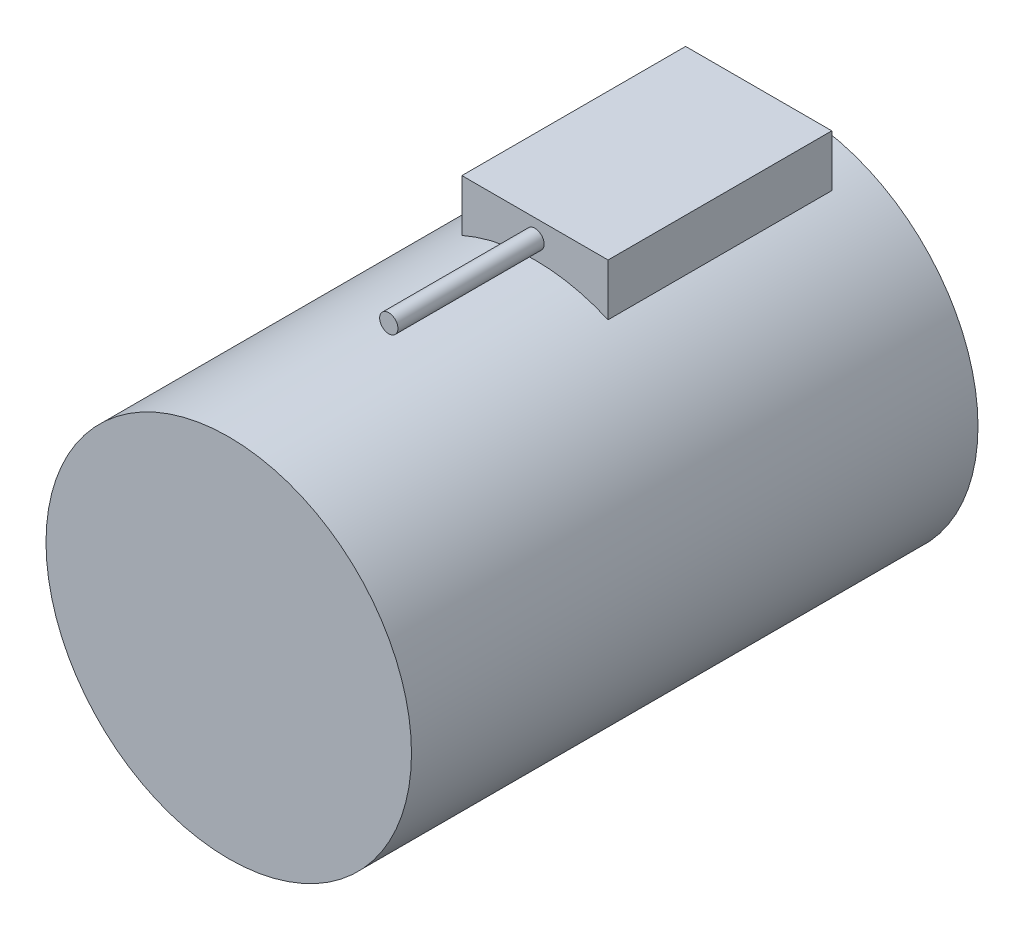
ISO-10303-21;
HEADER;
FILE_DESCRIPTION(('STEP AP214'),'2;1');
FILE_NAME('part.step','',(''),(''),'','','');
FILE_SCHEMA(('AUTOMOTIVE_DESIGN { 1 0 10303 214 1 1 1 1 }'));
ENDSEC;
DATA;
#1=APPLICATION_CONTEXT('core data for automotive mechanical design processes');
#2=APPLICATION_PROTOCOL_DEFINITION('international standard','automotive_design',2000,#1);
#3=PRODUCT_CONTEXT('',#1,'mechanical');
#4=PRODUCT('Part','Part','',(#3));
#5=PRODUCT_RELATED_PRODUCT_CATEGORY('part','',(#4));
#6=PRODUCT_DEFINITION_FORMATION('','',#4);
#7=PRODUCT_DEFINITION_CONTEXT('part definition',#1,'design');
#8=PRODUCT_DEFINITION('design','',#6,#7);
#9=PRODUCT_DEFINITION_SHAPE('','',#8);
#10=(LENGTH_UNIT() NAMED_UNIT(*) SI_UNIT(.MILLI.,.METRE.));
#11=(NAMED_UNIT(*) PLANE_ANGLE_UNIT() SI_UNIT($,.RADIAN.));
#12=(NAMED_UNIT(*) SI_UNIT($,.STERADIAN.) SOLID_ANGLE_UNIT());
#13=UNCERTAINTY_MEASURE_WITH_UNIT(LENGTH_MEASURE(1.E-05),#10,'distance_accuracy_value','');
#14=(GEOMETRIC_REPRESENTATION_CONTEXT(3) GLOBAL_UNCERTAINTY_ASSIGNED_CONTEXT((#13)) GLOBAL_UNIT_ASSIGNED_CONTEXT((#10,
#11,#12)) REPRESENTATION_CONTEXT('',''));
#15=CARTESIAN_POINT('',(0.,0.,0.));
#16=DIRECTION('',(0.,0.,1.));
#17=DIRECTION('',(1.,0.,0.));
#18=AXIS2_PLACEMENT_3D('',#15,#16,#17);
#19=CARTESIAN_POINT('',(0.,0.,196.85));
#20=DIRECTION('',(0.,0.,-1.));
#21=DIRECTION('',(-1.,0.,0.));
#22=AXIS2_PLACEMENT_3D('',#19,#20,#21);
#23=CYLINDRICAL_SURFACE('',#22,63.5);
#24=CARTESIAN_POINT('',(0.,0.,0.));
#25=DIRECTION('',(0.,0.,1.));
#26=DIRECTION('',(1.,0.,0.));
#27=AXIS2_PLACEMENT_3D('',#24,#25,#26);
#28=CIRCLE('',#27,63.5);
#29=CARTESIAN_POINT('',(63.5,0.,0.));
#30=VERTEX_POINT('',#29);
#31=EDGE_CURVE('E93',#30,#30,#28,.T.);
#32=ORIENTED_EDGE('',*,*,#31,.T.);
#33=EDGE_LOOP('',(#32));
#34=FACE_BOUND('',#33,.T.);
#35=CARTESIAN_POINT('',(0.,0.,196.85));
#36=DIRECTION('',(0.,0.,1.));
#37=DIRECTION('',(1.,0.,0.));
#38=AXIS2_PLACEMENT_3D('',#35,#36,#37);
#39=CIRCLE('',#38,63.5);
#40=CARTESIAN_POINT('',(63.5,0.,196.85));
#41=VERTEX_POINT('',#40);
#42=EDGE_CURVE('E96',#41,#41,#39,.T.);
#43=ORIENTED_EDGE('',*,*,#42,.F.);
#44=EDGE_LOOP('',(#43));
#45=FACE_BOUND('',#44,.T.);
#46=DIRECTION('',(0.,0.,-1.));
#47=VECTOR('',#46,1.);
#48=CARTESIAN_POINT('',(-25.4,58.1987113259392,196.85));
#49=LINE('',#48,#47);
#50=CARTESIAN_POINT('',(-25.4,58.1987113259392,12.7));
#51=VERTEX_POINT('',#50);
#52=CARTESIAN_POINT('',(-25.4,58.1987113259392,90.4392241865561));
#53=VERTEX_POINT('',#52);
#54=EDGE_CURVE('E40',#51,#53,#49,.F.);
#55=ORIENTED_EDGE('',*,*,#54,.F.);
#56=CARTESIAN_POINT('',(0.,0.,12.7));
#57=DIRECTION('',(0.,0.,1.));
#58=DIRECTION('',(1.,0.,0.));
#59=AXIS2_PLACEMENT_3D('',#56,#57,#58);
#60=CIRCLE('',#59,63.5);
#61=CARTESIAN_POINT('',(25.4,58.1987113259392,12.7));
#62=VERTEX_POINT('',#61);
#63=EDGE_CURVE('E103',#62,#51,#60,.T.);
#64=ORIENTED_EDGE('',*,*,#63,.F.);
#65=DIRECTION('',(0.,0.,-1.));
#66=VECTOR('',#65,1.);
#67=CARTESIAN_POINT('',(25.4,58.1987113259392,196.85));
#68=LINE('',#67,#66);
#69=CARTESIAN_POINT('',(25.4,58.1987113259392,90.4392241865561));
#70=VERTEX_POINT('',#69);
#71=EDGE_CURVE('E52',#70,#62,#68,.T.);
#72=ORIENTED_EDGE('',*,*,#71,.F.);
#73=CARTESIAN_POINT('',(0.,0.,90.4392241865561));
#74=DIRECTION('',(0.,0.,-1.));
#75=DIRECTION('',(-1.,0.,0.));
#76=AXIS2_PLACEMENT_3D('',#73,#74,#75);
#77=CIRCLE('',#76,63.5);
#78=EDGE_CURVE('E47',#53,#70,#77,.T.);
#79=ORIENTED_EDGE('',*,*,#78,.F.);
#80=EDGE_LOOP('',(#55,#64,#72,#79));
#81=FACE_BOUND('',#80,.T.);
#82=ADVANCED_FACE('F33',(#34,#45,#81),#23,.T.);
#83=CARTESIAN_POINT('',(0.,0.,196.85));
#84=DIRECTION('',(0.,0.,1.));
#85=DIRECTION('',(1.,0.,0.));
#86=AXIS2_PLACEMENT_3D('',#83,#84,#85);
#87=PLANE('',#86);
#88=ORIENTED_EDGE('',*,*,#42,.T.);
#89=EDGE_LOOP('',(#88));
#90=FACE_BOUND('',#89,.T.);
#91=ADVANCED_FACE('F119',(#90),#87,.T.);
#92=CARTESIAN_POINT('',(0.,0.,0.));
#93=DIRECTION('',(0.,0.,1.));
#94=DIRECTION('',(1.,0.,0.));
#95=AXIS2_PLACEMENT_3D('',#92,#93,#94);
#96=PLANE('',#95);
#97=ORIENTED_EDGE('',*,*,#31,.F.);
#98=EDGE_LOOP('',(#97));
#99=FACE_BOUND('',#98,.T.);
#100=ADVANCED_FACE('F124',(#99),#96,.F.);
#101=CARTESIAN_POINT('',(-25.4,76.2,12.7));
#102=DIRECTION('',(1.,0.,0.));
#103=DIRECTION('',(0.,0.,-1.));
#104=AXIS2_PLACEMENT_3D('',#101,#102,#103);
#105=PLANE('',#104);
#106=DIRECTION('',(0.,-1.,0.));
#107=VECTOR('',#106,1.);
#108=CARTESIAN_POINT('',(-25.4,76.2,12.7));
#109=LINE('',#108,#107);
#110=CARTESIAN_POINT('',(-25.4,76.2,12.7));
#111=VERTEX_POINT('',#110);
#112=EDGE_CURVE('E113',#111,#51,#109,.T.);
#113=ORIENTED_EDGE('',*,*,#112,.T.);
#114=ORIENTED_EDGE('',*,*,#54,.T.);
#115=DIRECTION('',(0.,-1.,0.));
#116=VECTOR('',#115,1.);
#117=CARTESIAN_POINT('',(-25.4,76.2,90.4392241865561));
#118=LINE('',#117,#116);
#119=CARTESIAN_POINT('',(-25.4,76.2,90.4392241865561));
#120=VERTEX_POINT('',#119);
#121=EDGE_CURVE('E75',#120,#53,#118,.T.);
#122=ORIENTED_EDGE('',*,*,#121,.F.);
#123=DIRECTION('',(0.,0.,1.));
#124=VECTOR('',#123,1.);
#125=CARTESIAN_POINT('',(-25.4,76.2,12.7));
#126=LINE('',#125,#124);
#127=EDGE_CURVE('E81',#111,#120,#126,.T.);
#128=ORIENTED_EDGE('',*,*,#127,.F.);
#129=EDGE_LOOP('',(#113,#114,#122,#128));
#130=FACE_BOUND('',#129,.T.);
#131=ADVANCED_FACE('F92',(#130),#105,.F.);
#132=CARTESIAN_POINT('',(25.4,76.2,12.7));
#133=DIRECTION('',(-1.,0.,0.));
#134=DIRECTION('',(0.,0.,1.));
#135=AXIS2_PLACEMENT_3D('',#132,#133,#134);
#136=PLANE('',#135);
#137=DIRECTION('',(0.,-1.,0.));
#138=VECTOR('',#137,1.);
#139=CARTESIAN_POINT('',(25.4,76.2,90.4392241865561));
#140=LINE('',#139,#138);
#141=CARTESIAN_POINT('',(25.4,76.2,90.4392241865561));
#142=VERTEX_POINT('',#141);
#143=EDGE_CURVE('E77',#142,#70,#140,.T.);
#144=ORIENTED_EDGE('',*,*,#143,.T.);
#145=ORIENTED_EDGE('',*,*,#71,.T.);
#146=DIRECTION('',(0.,-1.,0.));
#147=VECTOR('',#146,1.);
#148=CARTESIAN_POINT('',(25.4,76.2,12.7));
#149=LINE('',#148,#147);
#150=CARTESIAN_POINT('',(25.4,76.2,12.7));
#151=VERTEX_POINT('',#150);
#152=EDGE_CURVE('E98',#151,#62,#149,.T.);
#153=ORIENTED_EDGE('',*,*,#152,.F.);
#154=DIRECTION('',(0.,0.,-1.));
#155=VECTOR('',#154,1.);
#156=CARTESIAN_POINT('',(25.4,76.2,12.7));
#157=LINE('',#156,#155);
#158=EDGE_CURVE('E80',#142,#151,#157,.T.);
#159=ORIENTED_EDGE('',*,*,#158,.F.);
#160=EDGE_LOOP('',(#144,#145,#153,#159));
#161=FACE_BOUND('',#160,.T.);
#162=ADVANCED_FACE('F109',(#161),#136,.F.);
#163=CARTESIAN_POINT('',(-25.4,76.2,90.4392241865561));
#164=DIRECTION('',(0.,0.,-1.));
#165=DIRECTION('',(-1.,0.,0.));
#166=AXIS2_PLACEMENT_3D('',#163,#164,#165);
#167=PLANE('',#166);
#168=CARTESIAN_POINT('',(0.,69.85,90.4392241865561));
#169=DIRECTION('',(0.,0.,-1.));
#170=DIRECTION('',(-1.,0.,0.));
#171=AXIS2_PLACEMENT_3D('',#168,#169,#170);
#172=CIRCLE('',#171,3.175);
#173=CARTESIAN_POINT('',(-3.17499999999999,69.85,90.4392241865561));
#174=VERTEX_POINT('',#173);
#175=EDGE_CURVE('E11',#174,#174,#172,.F.);
#176=ORIENTED_EDGE('',*,*,#175,.F.);
#177=EDGE_LOOP('',(#176));
#178=FACE_BOUND('',#177,.T.);
#179=ORIENTED_EDGE('',*,*,#121,.T.);
#180=ORIENTED_EDGE('',*,*,#78,.T.);
#181=ORIENTED_EDGE('',*,*,#143,.F.);
#182=DIRECTION('',(1.,0.,0.));
#183=VECTOR('',#182,1.);
#184=CARTESIAN_POINT('',(-25.4,76.2,90.4392241865561));
#185=LINE('',#184,#183);
#186=EDGE_CURVE('E71',#120,#142,#185,.T.);
#187=ORIENTED_EDGE('',*,*,#186,.F.);
#188=EDGE_LOOP('',(#179,#180,#181,#187));
#189=FACE_BOUND('',#188,.T.);
#190=ADVANCED_FACE('F73',(#178,#189),#167,.F.);
#191=CARTESIAN_POINT('',(-25.4,76.2,12.7));
#192=DIRECTION('',(0.,0.,1.));
#193=DIRECTION('',(1.,0.,0.));
#194=AXIS2_PLACEMENT_3D('',#191,#192,#193);
#195=PLANE('',#194);
#196=ORIENTED_EDGE('',*,*,#152,.T.);
#197=ORIENTED_EDGE('',*,*,#63,.T.);
#198=ORIENTED_EDGE('',*,*,#112,.F.);
#199=DIRECTION('',(-1.,0.,0.));
#200=VECTOR('',#199,1.);
#201=CARTESIAN_POINT('',(-25.4,76.2,12.7));
#202=LINE('',#201,#200);
#203=EDGE_CURVE('E86',#151,#111,#202,.T.);
#204=ORIENTED_EDGE('',*,*,#203,.F.);
#205=EDGE_LOOP('',(#196,#197,#198,#204));
#206=FACE_BOUND('',#205,.T.);
#207=ADVANCED_FACE('F117',(#206),#195,.F.);
#208=CARTESIAN_POINT('',(0.,76.2,0.));
#209=DIRECTION('',(0.,1.,0.));
#210=DIRECTION('',(0.,0.,1.));
#211=AXIS2_PLACEMENT_3D('',#208,#209,#210);
#212=PLANE('',#211);
#213=ORIENTED_EDGE('',*,*,#127,.T.);
#214=ORIENTED_EDGE('',*,*,#186,.T.);
#215=ORIENTED_EDGE('',*,*,#158,.T.);
#216=ORIENTED_EDGE('',*,*,#203,.T.);
#217=EDGE_LOOP('',(#213,#214,#215,#216));
#218=FACE_BOUND('',#217,.T.);
#219=ADVANCED_FACE('F84',(#218),#212,.T.);
#220=CARTESIAN_POINT('',(0.,69.85,141.239224186556));
#221=DIRECTION('',(0.,0.,-1.));
#222=DIRECTION('',(-1.,0.,0.));
#223=AXIS2_PLACEMENT_3D('',#220,#221,#222);
#224=CYLINDRICAL_SURFACE('',#223,3.175);
#225=CARTESIAN_POINT('',(0.,69.85,141.239224186556));
#226=DIRECTION('',(0.,0.,1.));
#227=DIRECTION('',(1.,0.,0.));
#228=AXIS2_PLACEMENT_3D('',#225,#226,#227);
#229=CIRCLE('',#228,3.175);
#230=CARTESIAN_POINT('',(3.17500000000001,69.85,141.239224186556));
#231=VERTEX_POINT('',#230);
#232=EDGE_CURVE('E90',#231,#231,#229,.T.);
#233=ORIENTED_EDGE('',*,*,#232,.F.);
#234=EDGE_LOOP('',(#233));
#235=FACE_BOUND('',#234,.T.);
#236=ORIENTED_EDGE('',*,*,#175,.T.);
#237=EDGE_LOOP('',(#236));
#238=FACE_BOUND('',#237,.T.);
#239=ADVANCED_FACE('F146',(#235,#238),#224,.T.);
#240=CARTESIAN_POINT('',(0.,69.85,141.239224186556));
#241=DIRECTION('',(0.,0.,1.));
#242=DIRECTION('',(1.,0.,0.));
#243=AXIS2_PLACEMENT_3D('',#240,#241,#242);
#244=PLANE('',#243);
#245=ORIENTED_EDGE('',*,*,#232,.T.);
#246=EDGE_LOOP('',(#245));
#247=FACE_BOUND('',#246,.T.);
#248=ADVANCED_FACE('F149',(#247),#244,.T.);
#249=CLOSED_SHELL('',(#82,#91,#100,#131,#162,#190,#207,#219,#239,#248));
#250=MANIFOLD_SOLID_BREP('B2',#249);
#251=ADVANCED_BREP_SHAPE_REPRESENTATION('',(#18,#250),#14);
#252=SHAPE_DEFINITION_REPRESENTATION(#9,#251);
ENDSEC;
END-ISO-10303-21;
